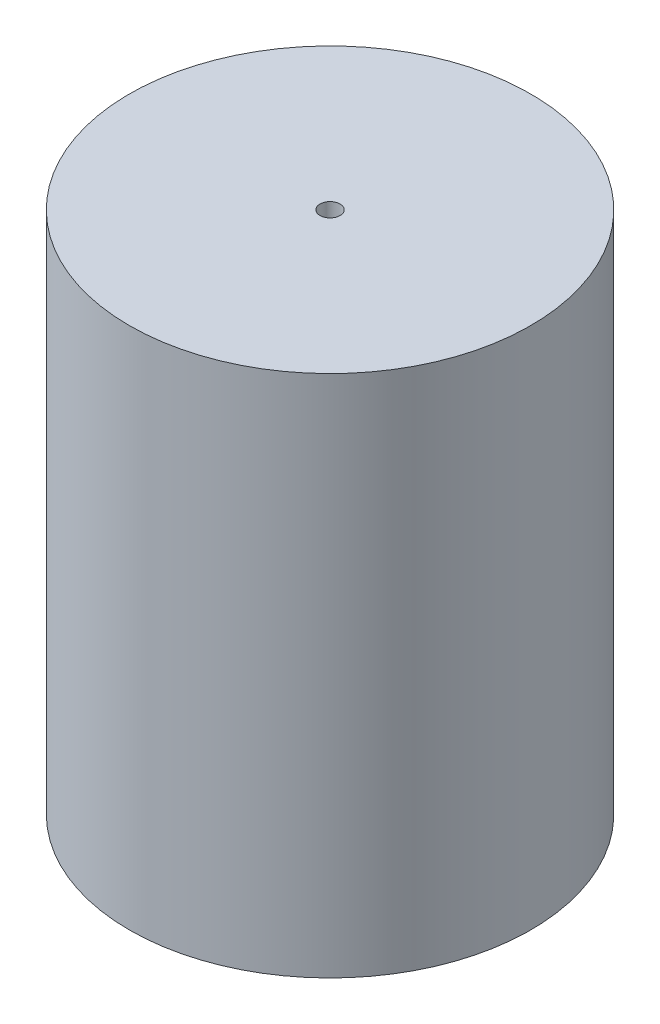
ISO-10303-21;
HEADER;
FILE_DESCRIPTION(('STEP AP214'),'2;1');
FILE_NAME('part.step','',(''),(''),'','','');
FILE_SCHEMA(('AUTOMOTIVE_DESIGN { 1 0 10303 214 1 1 1 1 }'));
ENDSEC;
DATA;
#1=APPLICATION_CONTEXT('core data for automotive mechanical design processes');
#2=APPLICATION_PROTOCOL_DEFINITION('international standard','automotive_design',2000,#1);
#3=PRODUCT_CONTEXT('',#1,'mechanical');
#4=PRODUCT('Part','Part','',(#3));
#5=PRODUCT_RELATED_PRODUCT_CATEGORY('part','',(#4));
#6=PRODUCT_DEFINITION_FORMATION('','',#4);
#7=PRODUCT_DEFINITION_CONTEXT('part definition',#1,'design');
#8=PRODUCT_DEFINITION('design','',#6,#7);
#9=PRODUCT_DEFINITION_SHAPE('','',#8);
#10=(LENGTH_UNIT() NAMED_UNIT(*) SI_UNIT(.MILLI.,.METRE.));
#11=(NAMED_UNIT(*) PLANE_ANGLE_UNIT() SI_UNIT($,.RADIAN.));
#12=(NAMED_UNIT(*) SI_UNIT($,.STERADIAN.) SOLID_ANGLE_UNIT());
#13=UNCERTAINTY_MEASURE_WITH_UNIT(LENGTH_MEASURE(1.E-05),#10,'distance_accuracy_value','');
#14=(GEOMETRIC_REPRESENTATION_CONTEXT(3) GLOBAL_UNCERTAINTY_ASSIGNED_CONTEXT((#13)) GLOBAL_UNIT_ASSIGNED_CONTEXT((#10,
#11,#12)) REPRESENTATION_CONTEXT('',''));
#15=CARTESIAN_POINT('',(0.,0.,0.));
#16=DIRECTION('',(0.,0.,1.));
#17=DIRECTION('',(1.,0.,0.));
#18=AXIS2_PLACEMENT_3D('',#15,#16,#17);
#19=CARTESIAN_POINT('',(0.,60.,0.));
#20=DIRECTION('',(0.,-1.,0.));
#21=DIRECTION('',(0.,0.,-1.));
#22=AXIS2_PLACEMENT_3D('',#19,#20,#21);
#23=CYLINDRICAL_SURFACE('',#22,23.);
#24=CARTESIAN_POINT('',(0.,60.,0.));
#25=DIRECTION('',(0.,1.,0.));
#26=DIRECTION('',(0.,0.,1.));
#27=AXIS2_PLACEMENT_3D('',#24,#25,#26);
#28=CIRCLE('',#27,23.);
#29=CARTESIAN_POINT('',(0.,60.,23.));
#30=VERTEX_POINT('',#29);
#31=EDGE_CURVE('E10',#30,#30,#28,.T.);
#32=ORIENTED_EDGE('',*,*,#31,.F.);
#33=EDGE_LOOP('',(#32));
#34=FACE_BOUND('',#33,.T.);
#35=CARTESIAN_POINT('',(0.,0.,0.));
#36=DIRECTION('',(0.,1.,0.));
#37=DIRECTION('',(0.,0.,1.));
#38=AXIS2_PLACEMENT_3D('',#35,#36,#37);
#39=CIRCLE('',#38,23.);
#40=CARTESIAN_POINT('',(0.,0.,23.));
#41=VERTEX_POINT('',#40);
#42=EDGE_CURVE('E45',#41,#41,#39,.T.);
#43=ORIENTED_EDGE('',*,*,#42,.T.);
#44=EDGE_LOOP('',(#43));
#45=FACE_BOUND('',#44,.T.);
#46=ADVANCED_FACE('F37',(#34,#45),#23,.T.);
#47=CARTESIAN_POINT('',(0.,60.,0.));
#48=DIRECTION('',(0.,1.,0.));
#49=DIRECTION('',(0.,0.,1.));
#50=AXIS2_PLACEMENT_3D('',#47,#48,#49);
#51=PLANE('',#50);
#52=CARTESIAN_POINT('',(0.,60.,0.));
#53=DIRECTION('',(0.,1.,0.));
#54=DIRECTION('',(0.,0.,1.));
#55=AXIS2_PLACEMENT_3D('',#52,#53,#54);
#56=CIRCLE('',#55,1.15);
#57=CARTESIAN_POINT('',(0.,60.,1.15));
#58=VERTEX_POINT('',#57);
#59=EDGE_CURVE('E60',#58,#58,#56,.T.);
#60=ORIENTED_EDGE('',*,*,#59,.F.);
#61=EDGE_LOOP('',(#60));
#62=FACE_BOUND('',#61,.T.);
#63=ORIENTED_EDGE('',*,*,#31,.T.);
#64=EDGE_LOOP('',(#63));
#65=FACE_BOUND('',#64,.T.);
#66=ADVANCED_FACE('F86',(#62,#65),#51,.T.);
#67=CARTESIAN_POINT('',(0.,0.,0.));
#68=DIRECTION('',(0.,1.,0.));
#69=DIRECTION('',(0.,0.,1.));
#70=AXIS2_PLACEMENT_3D('',#67,#68,#69);
#71=PLANE('',#70);
#72=CARTESIAN_POINT('',(0.,0.,0.));
#73=DIRECTION('',(0.,-1.,0.));
#74=DIRECTION('',(0.,0.,-1.));
#75=AXIS2_PLACEMENT_3D('',#72,#73,#74);
#76=CIRCLE('',#75,20.);
#77=CARTESIAN_POINT('',(0.,0.,-20.));
#78=VERTEX_POINT('',#77);
#79=EDGE_CURVE('E53',#78,#78,#76,.T.);
#80=ORIENTED_EDGE('',*,*,#79,.F.);
#81=EDGE_LOOP('',(#80));
#82=FACE_BOUND('',#81,.T.);
#83=ORIENTED_EDGE('',*,*,#42,.F.);
#84=EDGE_LOOP('',(#83));
#85=FACE_BOUND('',#84,.T.);
#86=ADVANCED_FACE('F80',(#82,#85),#71,.F.);
#87=CARTESIAN_POINT('',(0.,48.,0.));
#88=DIRECTION('',(0.,-1.,0.));
#89=DIRECTION('',(0.,0.,-1.));
#90=AXIS2_PLACEMENT_3D('',#87,#88,#89);
#91=CYLINDRICAL_SURFACE('',#90,20.);
#92=CARTESIAN_POINT('',(0.,48.,0.));
#93=DIRECTION('',(0.,-1.,0.));
#94=DIRECTION('',(0.,0.,-1.));
#95=AXIS2_PLACEMENT_3D('',#92,#93,#94);
#96=CIRCLE('',#95,20.);
#97=CARTESIAN_POINT('',(0.,48.,-20.));
#98=VERTEX_POINT('',#97);
#99=EDGE_CURVE('E51',#98,#98,#96,.T.);
#100=ORIENTED_EDGE('',*,*,#99,.F.);
#101=EDGE_LOOP('',(#100));
#102=FACE_BOUND('',#101,.T.);
#103=ORIENTED_EDGE('',*,*,#79,.T.);
#104=EDGE_LOOP('',(#103));
#105=FACE_BOUND('',#104,.T.);
#106=ADVANCED_FACE('F74',(#102,#105),#91,.F.);
#107=CARTESIAN_POINT('',(0.,48.,0.));
#108=DIRECTION('',(0.,-1.,0.));
#109=DIRECTION('',(0.,0.,-1.));
#110=AXIS2_PLACEMENT_3D('',#107,#108,#109);
#111=PLANE('',#110);
#112=CARTESIAN_POINT('',(0.,48.,0.));
#113=DIRECTION('',(0.,-1.,0.));
#114=DIRECTION('',(0.,0.,-1.));
#115=AXIS2_PLACEMENT_3D('',#112,#113,#114);
#116=CIRCLE('',#115,1.15);
#117=CARTESIAN_POINT('',(0.,48.,-1.15));
#118=VERTEX_POINT('',#117);
#119=EDGE_CURVE('E40',#118,#118,#116,.T.);
#120=ORIENTED_EDGE('',*,*,#119,.F.);
#121=EDGE_LOOP('',(#120));
#122=FACE_BOUND('',#121,.T.);
#123=ORIENTED_EDGE('',*,*,#99,.T.);
#124=EDGE_LOOP('',(#123));
#125=FACE_BOUND('',#124,.T.);
#126=ADVANCED_FACE('F71',(#122,#125),#111,.T.);
#127=CARTESIAN_POINT('',(0.,9.99999999999999,0.));
#128=DIRECTION('',(0.,1.,0.));
#129=DIRECTION('',(0.,0.,1.));
#130=AXIS2_PLACEMENT_3D('',#127,#128,#129);
#131=CYLINDRICAL_SURFACE('',#130,1.15);
#132=ORIENTED_EDGE('',*,*,#119,.T.);
#133=EDGE_LOOP('',(#132));
#134=FACE_BOUND('',#133,.T.);
#135=ORIENTED_EDGE('',*,*,#59,.T.);
#136=EDGE_LOOP('',(#135));
#137=FACE_BOUND('',#136,.T.);
#138=ADVANCED_FACE('F69',(#134,#137),#131,.F.);
#139=CLOSED_SHELL('',(#46,#66,#86,#106,#126,#138));
#140=MANIFOLD_SOLID_BREP('B2',#139);
#141=ADVANCED_BREP_SHAPE_REPRESENTATION('',(#18,#140),#14);
#142=SHAPE_DEFINITION_REPRESENTATION(#9,#141);
ENDSEC;
END-ISO-10303-21;
